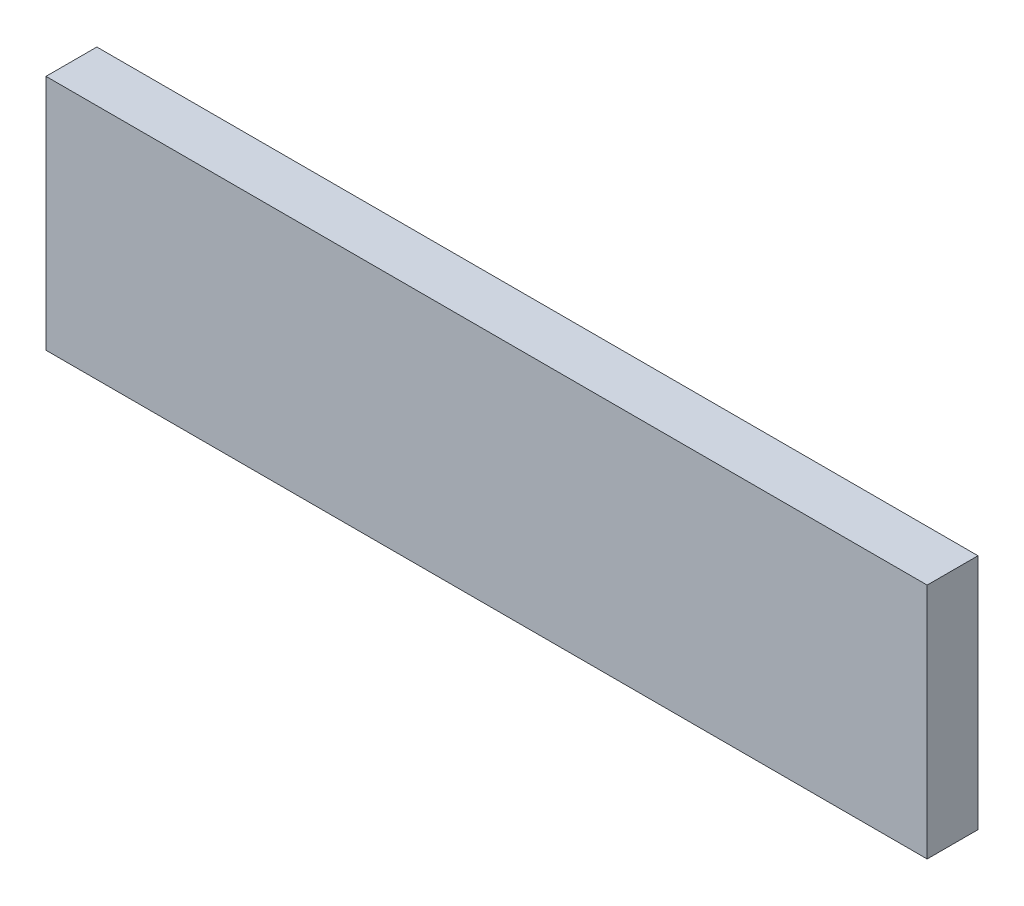
ISO-10303-21;
HEADER;
FILE_DESCRIPTION(('STEP AP214'),'2;1');
FILE_NAME('part.step','',(''),(''),'','','');
FILE_SCHEMA(('AUTOMOTIVE_DESIGN { 1 0 10303 214 1 1 1 1 }'));
ENDSEC;
DATA;
#1=APPLICATION_CONTEXT('core data for automotive mechanical design processes');
#2=APPLICATION_PROTOCOL_DEFINITION('international standard','automotive_design',2000,#1);
#3=PRODUCT_CONTEXT('',#1,'mechanical');
#4=PRODUCT('Part','Part','',(#3));
#5=PRODUCT_RELATED_PRODUCT_CATEGORY('part','',(#4));
#6=PRODUCT_DEFINITION_FORMATION('','',#4);
#7=PRODUCT_DEFINITION_CONTEXT('part definition',#1,'design');
#8=PRODUCT_DEFINITION('design','',#6,#7);
#9=PRODUCT_DEFINITION_SHAPE('','',#8);
#10=(LENGTH_UNIT() NAMED_UNIT(*) SI_UNIT(.MILLI.,.METRE.));
#11=(NAMED_UNIT(*) PLANE_ANGLE_UNIT() SI_UNIT($,.RADIAN.));
#12=(NAMED_UNIT(*) SI_UNIT($,.STERADIAN.) SOLID_ANGLE_UNIT());
#13=UNCERTAINTY_MEASURE_WITH_UNIT(LENGTH_MEASURE(1.E-05),#10,'distance_accuracy_value','');
#14=(GEOMETRIC_REPRESENTATION_CONTEXT(3) GLOBAL_UNCERTAINTY_ASSIGNED_CONTEXT((#13)) GLOBAL_UNIT_ASSIGNED_CONTEXT((#10,
#11,#12)) REPRESENTATION_CONTEXT('',''));
#15=CARTESIAN_POINT('',(0.,0.,0.));
#16=DIRECTION('',(0.,0.,1.));
#17=DIRECTION('',(1.,0.,0.));
#18=AXIS2_PLACEMENT_3D('',#15,#16,#17);
#19=CARTESIAN_POINT('',(110.3497155935,188.193630233048,3.));
#20=DIRECTION('',(-1.,0.,0.));
#21=DIRECTION('',(0.,0.,1.));
#22=AXIS2_PLACEMENT_3D('',#19,#20,#21);
#23=PLANE('',#22);
#24=DIRECTION('',(0.,1.,0.));
#25=VECTOR('',#24,1.);
#26=CARTESIAN_POINT('',(110.3497155935,188.193630233048,0.));
#27=LINE('',#26,#25);
#28=CARTESIAN_POINT('',(110.3497155935,174.193630233048,0.));
#29=VERTEX_POINT('',#28);
#30=CARTESIAN_POINT('',(110.3497155935,188.193630233048,0.));
#31=VERTEX_POINT('',#30);
#32=EDGE_CURVE('E99',#29,#31,#27,.T.);
#33=ORIENTED_EDGE('',*,*,#32,.T.);
#34=DIRECTION('',(0.,0.,-1.));
#35=VECTOR('',#34,1.);
#36=CARTESIAN_POINT('',(110.3497155935,188.193630233048,3.));
#37=LINE('',#36,#35);
#38=CARTESIAN_POINT('',(110.3497155935,188.193630233048,3.));
#39=VERTEX_POINT('',#38);
#40=EDGE_CURVE('E11',#39,#31,#37,.T.);
#41=ORIENTED_EDGE('',*,*,#40,.F.);
#42=DIRECTION('',(0.,1.,0.));
#43=VECTOR('',#42,1.);
#44=CARTESIAN_POINT('',(110.3497155935,188.193630233048,3.));
#45=LINE('',#44,#43);
#46=CARTESIAN_POINT('',(110.3497155935,174.193630233048,3.));
#47=VERTEX_POINT('',#46);
#48=EDGE_CURVE('E87',#47,#39,#45,.T.);
#49=ORIENTED_EDGE('',*,*,#48,.F.);
#50=DIRECTION('',(0.,0.,-1.));
#51=VECTOR('',#50,1.);
#52=CARTESIAN_POINT('',(110.3497155935,174.193630233048,3.));
#53=LINE('',#52,#51);
#54=EDGE_CURVE('E95',#47,#29,#53,.T.);
#55=ORIENTED_EDGE('',*,*,#54,.T.);
#56=EDGE_LOOP('',(#33,#41,#49,#55));
#57=FACE_BOUND('',#56,.T.);
#58=ADVANCED_FACE('F36',(#57),#23,.F.);
#59=CARTESIAN_POINT('',(58.3497155935002,188.193630233048,3.));
#60=DIRECTION('',(0.,-1.,0.));
#61=DIRECTION('',(0.,0.,-1.));
#62=AXIS2_PLACEMENT_3D('',#59,#60,#61);
#63=PLANE('',#62);
#64=DIRECTION('',(-1.,0.,0.));
#65=VECTOR('',#64,1.);
#66=CARTESIAN_POINT('',(58.3497155935002,188.193630233048,0.));
#67=LINE('',#66,#65);
#68=CARTESIAN_POINT('',(58.3497155935002,188.193630233048,0.));
#69=VERTEX_POINT('',#68);
#70=EDGE_CURVE('E91',#31,#69,#67,.T.);
#71=ORIENTED_EDGE('',*,*,#70,.T.);
#72=DIRECTION('',(0.,0.,-1.));
#73=VECTOR('',#72,1.);
#74=CARTESIAN_POINT('',(58.3497155935002,188.193630233048,3.));
#75=LINE('',#74,#73);
#76=CARTESIAN_POINT('',(58.3497155935002,188.193630233048,3.));
#77=VERTEX_POINT('',#76);
#78=EDGE_CURVE('E44',#77,#69,#75,.T.);
#79=ORIENTED_EDGE('',*,*,#78,.F.);
#80=DIRECTION('',(-1.,0.,0.));
#81=VECTOR('',#80,1.);
#82=CARTESIAN_POINT('',(58.3497155935002,188.193630233048,3.));
#83=LINE('',#82,#81);
#84=EDGE_CURVE('E82',#39,#77,#83,.T.);
#85=ORIENTED_EDGE('',*,*,#84,.F.);
#86=ORIENTED_EDGE('',*,*,#40,.T.);
#87=EDGE_LOOP('',(#71,#79,#85,#86));
#88=FACE_BOUND('',#87,.T.);
#89=ADVANCED_FACE('F90',(#88),#63,.F.);
#90=CARTESIAN_POINT('',(58.3497155935002,188.193630233048,3.));
#91=DIRECTION('',(1.,0.,0.));
#92=DIRECTION('',(0.,1.,0.));
#93=AXIS2_PLACEMENT_3D('',#90,#91,#92);
#94=PLANE('',#93);
#95=DIRECTION('',(0.,-1.,0.));
#96=VECTOR('',#95,1.);
#97=CARTESIAN_POINT('',(58.3497155935002,188.193630233048,0.));
#98=LINE('',#97,#96);
#99=CARTESIAN_POINT('',(58.3497155935002,174.193630233048,0.));
#100=VERTEX_POINT('',#99);
#101=EDGE_CURVE('E69',#69,#100,#98,.T.);
#102=ORIENTED_EDGE('',*,*,#101,.T.);
#103=DIRECTION('',(0.,0.,-1.));
#104=VECTOR('',#103,1.);
#105=CARTESIAN_POINT('',(58.3497155935002,174.193630233048,3.));
#106=LINE('',#105,#104);
#107=CARTESIAN_POINT('',(58.3497155935002,174.193630233048,3.));
#108=VERTEX_POINT('',#107);
#109=EDGE_CURVE('E92',#108,#100,#106,.T.);
#110=ORIENTED_EDGE('',*,*,#109,.F.);
#111=DIRECTION('',(0.,-1.,0.));
#112=VECTOR('',#111,1.);
#113=CARTESIAN_POINT('',(58.3497155935002,188.193630233048,3.));
#114=LINE('',#113,#112);
#115=EDGE_CURVE('E85',#77,#108,#114,.T.);
#116=ORIENTED_EDGE('',*,*,#115,.F.);
#117=ORIENTED_EDGE('',*,*,#78,.T.);
#118=EDGE_LOOP('',(#102,#110,#116,#117));
#119=FACE_BOUND('',#118,.T.);
#120=ADVANCED_FACE('F93',(#119),#94,.F.);
#121=CARTESIAN_POINT('',(58.3497155935002,174.193630233048,3.));
#122=DIRECTION('',(0.,1.,0.));
#123=DIRECTION('',(0.,0.,1.));
#124=AXIS2_PLACEMENT_3D('',#121,#122,#123);
#125=PLANE('',#124);
#126=DIRECTION('',(1.,0.,0.));
#127=VECTOR('',#126,1.);
#128=CARTESIAN_POINT('',(58.3497155935002,174.193630233048,0.));
#129=LINE('',#128,#127);
#130=EDGE_CURVE('E75',#100,#29,#129,.T.);
#131=ORIENTED_EDGE('',*,*,#130,.T.);
#132=ORIENTED_EDGE('',*,*,#54,.F.);
#133=DIRECTION('',(1.,0.,0.));
#134=VECTOR('',#133,1.);
#135=CARTESIAN_POINT('',(58.3497155935002,174.193630233048,3.));
#136=LINE('',#135,#134);
#137=EDGE_CURVE('E52',#108,#47,#136,.T.);
#138=ORIENTED_EDGE('',*,*,#137,.F.);
#139=ORIENTED_EDGE('',*,*,#109,.T.);
#140=EDGE_LOOP('',(#131,#132,#138,#139));
#141=FACE_BOUND('',#140,.T.);
#142=ADVANCED_FACE('F106',(#141),#125,.F.);
#143=CARTESIAN_POINT('',(0.,0.,3.));
#144=DIRECTION('',(0.,0.,1.));
#145=DIRECTION('',(1.,0.,0.));
#146=AXIS2_PLACEMENT_3D('',#143,#144,#145);
#147=PLANE('',#146);
#148=ORIENTED_EDGE('',*,*,#48,.T.);
#149=ORIENTED_EDGE('',*,*,#84,.T.);
#150=ORIENTED_EDGE('',*,*,#115,.T.);
#151=ORIENTED_EDGE('',*,*,#137,.T.);
#152=EDGE_LOOP('',(#148,#149,#150,#151));
#153=FACE_BOUND('',#152,.T.);
#154=ADVANCED_FACE('F83',(#153),#147,.T.);
#155=CARTESIAN_POINT('',(0.,0.,0.));
#156=DIRECTION('',(0.,0.,1.));
#157=DIRECTION('',(1.,0.,0.));
#158=AXIS2_PLACEMENT_3D('',#155,#156,#157);
#159=PLANE('',#158);
#160=ORIENTED_EDGE('',*,*,#32,.F.);
#161=ORIENTED_EDGE('',*,*,#130,.F.);
#162=ORIENTED_EDGE('',*,*,#101,.F.);
#163=ORIENTED_EDGE('',*,*,#70,.F.);
#164=EDGE_LOOP('',(#160,#161,#162,#163));
#165=FACE_BOUND('',#164,.T.);
#166=ADVANCED_FACE('F109',(#165),#159,.F.);
#167=CLOSED_SHELL('',(#58,#89,#120,#142,#154,#166));
#168=MANIFOLD_SOLID_BREP('B2',#167);
#169=ADVANCED_BREP_SHAPE_REPRESENTATION('',(#18,#168),#14);
#170=SHAPE_DEFINITION_REPRESENTATION(#9,#169);
ENDSEC;
END-ISO-10303-21;
